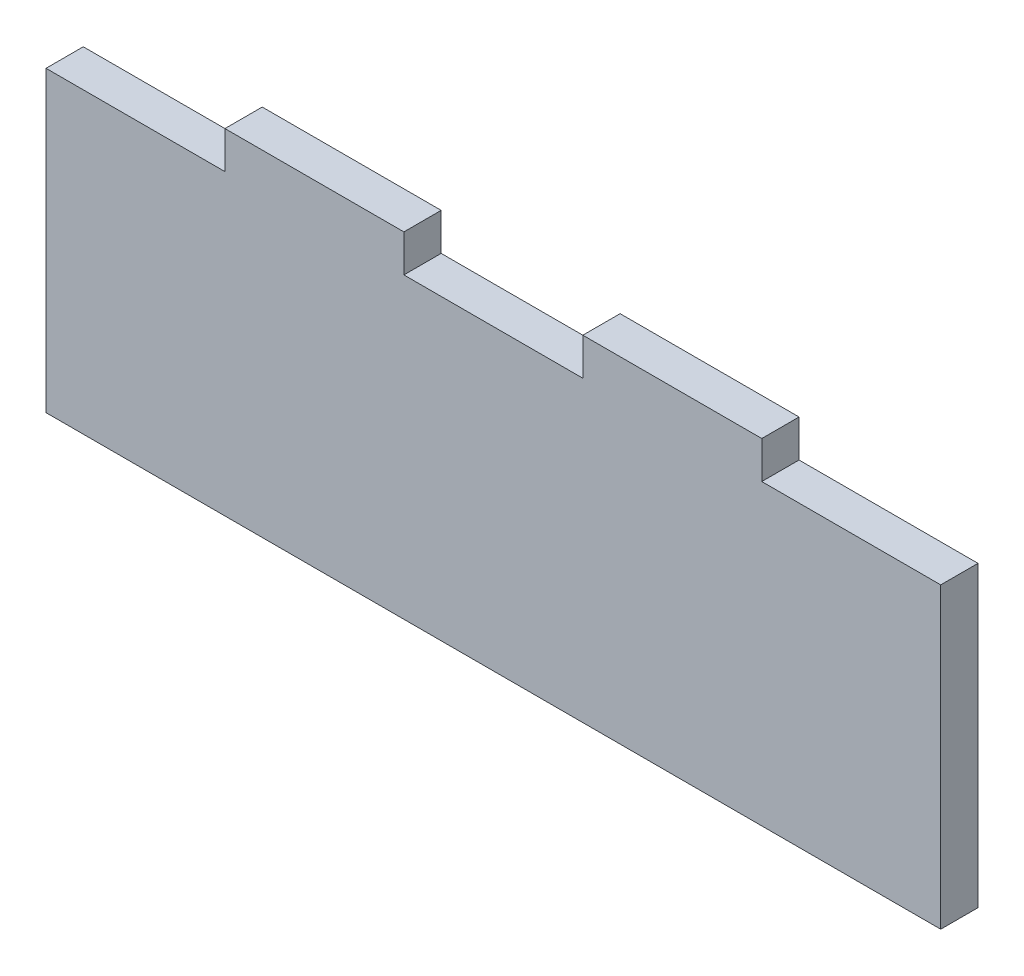
ISO-10303-21;
HEADER;
FILE_DESCRIPTION(('STEP AP214'),'2;1');
FILE_NAME('part.step','',(''),(''),'','','');
FILE_SCHEMA(('AUTOMOTIVE_DESIGN { 1 0 10303 214 1 1 1 1 }'));
ENDSEC;
DATA;
#1=APPLICATION_CONTEXT('core data for automotive mechanical design processes');
#2=APPLICATION_PROTOCOL_DEFINITION('international standard','automotive_design',2000,#1);
#3=PRODUCT_CONTEXT('',#1,'mechanical');
#4=PRODUCT('Part','Part','',(#3));
#5=PRODUCT_RELATED_PRODUCT_CATEGORY('part','',(#4));
#6=PRODUCT_DEFINITION_FORMATION('','',#4);
#7=PRODUCT_DEFINITION_CONTEXT('part definition',#1,'design');
#8=PRODUCT_DEFINITION('design','',#6,#7);
#9=PRODUCT_DEFINITION_SHAPE('','',#8);
#10=(LENGTH_UNIT() NAMED_UNIT(*) SI_UNIT(.MILLI.,.METRE.));
#11=(NAMED_UNIT(*) PLANE_ANGLE_UNIT() SI_UNIT($,.RADIAN.));
#12=(NAMED_UNIT(*) SI_UNIT($,.STERADIAN.) SOLID_ANGLE_UNIT());
#13=UNCERTAINTY_MEASURE_WITH_UNIT(LENGTH_MEASURE(1.E-05),#10,'distance_accuracy_value','');
#14=(GEOMETRIC_REPRESENTATION_CONTEXT(3) GLOBAL_UNCERTAINTY_ASSIGNED_CONTEXT((#13)) GLOBAL_UNIT_ASSIGNED_CONTEXT((#10,
#11,#12)) REPRESENTATION_CONTEXT('',''));
#15=CARTESIAN_POINT('',(0.,0.,0.));
#16=DIRECTION('',(0.,0.,1.));
#17=DIRECTION('',(1.,0.,0.));
#18=AXIS2_PLACEMENT_3D('',#15,#16,#17);
#19=CARTESIAN_POINT('',(30.48,50.8,6.35));
#20=DIRECTION('',(0.,-1.,0.));
#21=DIRECTION('',(0.,0.,-1.));
#22=AXIS2_PLACEMENT_3D('',#19,#20,#21);
#23=PLANE('',#22);
#24=DIRECTION('',(-1.,0.,0.));
#25=VECTOR('',#24,1.);
#26=CARTESIAN_POINT('',(30.48,50.8,0.));
#27=LINE('',#26,#25);
#28=CARTESIAN_POINT('',(30.48,50.8,0.));
#29=VERTEX_POINT('',#28);
#30=CARTESIAN_POINT('',(0.,50.8,0.));
#31=VERTEX_POINT('',#30);
#32=EDGE_CURVE('E164',#29,#31,#27,.T.);
#33=ORIENTED_EDGE('',*,*,#32,.T.);
#34=DIRECTION('',(0.,0.,-1.));
#35=VECTOR('',#34,1.);
#36=CARTESIAN_POINT('',(0.,50.8,6.35));
#37=LINE('',#36,#35);
#38=CARTESIAN_POINT('',(0.,50.8,6.35));
#39=VERTEX_POINT('',#38);
#40=EDGE_CURVE('E11',#39,#31,#37,.T.);
#41=ORIENTED_EDGE('',*,*,#40,.F.);
#42=DIRECTION('',(-1.,0.,0.));
#43=VECTOR('',#42,1.);
#44=CARTESIAN_POINT('',(30.48,50.8,6.35));
#45=LINE('',#44,#43);
#46=CARTESIAN_POINT('',(30.48,50.8,6.35));
#47=VERTEX_POINT('',#46);
#48=EDGE_CURVE('E198',#47,#39,#45,.T.);
#49=ORIENTED_EDGE('',*,*,#48,.F.);
#50=DIRECTION('',(0.,0.,-1.));
#51=VECTOR('',#50,1.);
#52=CARTESIAN_POINT('',(30.48,50.8,6.35));
#53=LINE('',#52,#51);
#54=EDGE_CURVE('E160',#47,#29,#53,.T.);
#55=ORIENTED_EDGE('',*,*,#54,.T.);
#56=EDGE_LOOP('',(#33,#41,#49,#55));
#57=FACE_BOUND('',#56,.T.);
#58=ADVANCED_FACE('F39',(#57),#23,.F.);
#59=CARTESIAN_POINT('',(0.,50.8,6.35));
#60=DIRECTION('',(1.,0.,0.));
#61=DIRECTION('',(0.,0.,-1.));
#62=AXIS2_PLACEMENT_3D('',#59,#60,#61);
#63=PLANE('',#62);
#64=DIRECTION('',(0.,-1.,0.));
#65=VECTOR('',#64,1.);
#66=CARTESIAN_POINT('',(0.,50.8,0.));
#67=LINE('',#66,#65);
#68=CARTESIAN_POINT('',(0.,0.,0.));
#69=VERTEX_POINT('',#68);
#70=EDGE_CURVE('E168',#31,#69,#67,.T.);
#71=ORIENTED_EDGE('',*,*,#70,.T.);
#72=DIRECTION('',(0.,0.,-1.));
#73=VECTOR('',#72,1.);
#74=CARTESIAN_POINT('',(0.,0.,6.35));
#75=LINE('',#74,#73);
#76=CARTESIAN_POINT('',(0.,0.,6.35));
#77=VERTEX_POINT('',#76);
#78=EDGE_CURVE('E48',#77,#69,#75,.T.);
#79=ORIENTED_EDGE('',*,*,#78,.F.);
#80=DIRECTION('',(0.,-1.,0.));
#81=VECTOR('',#80,1.);
#82=CARTESIAN_POINT('',(0.,50.8,6.35));
#83=LINE('',#82,#81);
#84=EDGE_CURVE('E111',#39,#77,#83,.T.);
#85=ORIENTED_EDGE('',*,*,#84,.F.);
#86=ORIENTED_EDGE('',*,*,#40,.T.);
#87=EDGE_LOOP('',(#71,#79,#85,#86));
#88=FACE_BOUND('',#87,.T.);
#89=ADVANCED_FACE('F292',(#88),#63,.F.);
#90=CARTESIAN_POINT('',(0.,0.,6.35));
#91=DIRECTION('',(0.,1.,0.));
#92=DIRECTION('',(0.,0.,1.));
#93=AXIS2_PLACEMENT_3D('',#90,#91,#92);
#94=PLANE('',#93);
#95=DIRECTION('',(1.,0.,0.));
#96=VECTOR('',#95,1.);
#97=CARTESIAN_POINT('',(0.,0.,0.));
#98=LINE('',#97,#96);
#99=CARTESIAN_POINT('',(152.4,0.,0.));
#100=VERTEX_POINT('',#99);
#101=EDGE_CURVE('E171',#69,#100,#98,.T.);
#102=ORIENTED_EDGE('',*,*,#101,.T.);
#103=DIRECTION('',(0.,0.,-1.));
#104=VECTOR('',#103,1.);
#105=CARTESIAN_POINT('',(152.4,0.,6.35));
#106=LINE('',#105,#104);
#107=CARTESIAN_POINT('',(152.4,0.,6.35));
#108=VERTEX_POINT('',#107);
#109=EDGE_CURVE('E225',#108,#100,#106,.T.);
#110=ORIENTED_EDGE('',*,*,#109,.F.);
#111=DIRECTION('',(1.,0.,0.));
#112=VECTOR('',#111,1.);
#113=CARTESIAN_POINT('',(0.,0.,6.35));
#114=LINE('',#113,#112);
#115=EDGE_CURVE('E235',#77,#108,#114,.T.);
#116=ORIENTED_EDGE('',*,*,#115,.F.);
#117=ORIENTED_EDGE('',*,*,#78,.T.);
#118=EDGE_LOOP('',(#102,#110,#116,#117));
#119=FACE_BOUND('',#118,.T.);
#120=ADVANCED_FACE('F233',(#119),#94,.F.);
#121=CARTESIAN_POINT('',(152.4,0.,6.35));
#122=DIRECTION('',(-1.,0.,0.));
#123=DIRECTION('',(0.,0.,1.));
#124=AXIS2_PLACEMENT_3D('',#121,#122,#123);
#125=PLANE('',#124);
#126=DIRECTION('',(0.,1.,0.));
#127=VECTOR('',#126,1.);
#128=CARTESIAN_POINT('',(152.4,0.,0.));
#129=LINE('',#128,#127);
#130=CARTESIAN_POINT('',(152.4,50.8,0.));
#131=VERTEX_POINT('',#130);
#132=EDGE_CURVE('E174',#100,#131,#129,.T.);
#133=ORIENTED_EDGE('',*,*,#132,.T.);
#134=DIRECTION('',(0.,0.,-1.));
#135=VECTOR('',#134,1.);
#136=CARTESIAN_POINT('',(152.4,50.8,6.35));
#137=LINE('',#136,#135);
#138=CARTESIAN_POINT('',(152.4,50.8,6.35));
#139=VERTEX_POINT('',#138);
#140=EDGE_CURVE('E221',#139,#131,#137,.T.);
#141=ORIENTED_EDGE('',*,*,#140,.F.);
#142=DIRECTION('',(0.,1.,0.));
#143=VECTOR('',#142,1.);
#144=CARTESIAN_POINT('',(152.4,0.,6.35));
#145=LINE('',#144,#143);
#146=EDGE_CURVE('E254',#108,#139,#145,.T.);
#147=ORIENTED_EDGE('',*,*,#146,.F.);
#148=ORIENTED_EDGE('',*,*,#109,.T.);
#149=EDGE_LOOP('',(#133,#141,#147,#148));
#150=FACE_BOUND('',#149,.T.);
#151=ADVANCED_FACE('F244',(#150),#125,.F.);
#152=CARTESIAN_POINT('',(152.4,50.8,6.35));
#153=DIRECTION('',(0.,-1.,0.));
#154=DIRECTION('',(0.,0.,-1.));
#155=AXIS2_PLACEMENT_3D('',#152,#153,#154);
#156=PLANE('',#155);
#157=DIRECTION('',(-1.,0.,0.));
#158=VECTOR('',#157,1.);
#159=CARTESIAN_POINT('',(152.4,50.8,0.));
#160=LINE('',#159,#158);
#161=CARTESIAN_POINT('',(121.92,50.8,0.));
#162=VERTEX_POINT('',#161);
#163=EDGE_CURVE('E177',#131,#162,#160,.T.);
#164=ORIENTED_EDGE('',*,*,#163,.T.);
#165=DIRECTION('',(0.,0.,-1.));
#166=VECTOR('',#165,1.);
#167=CARTESIAN_POINT('',(121.92,50.8,6.35));
#168=LINE('',#167,#166);
#169=CARTESIAN_POINT('',(121.92,50.8,6.35));
#170=VERTEX_POINT('',#169);
#171=EDGE_CURVE('E217',#170,#162,#168,.T.);
#172=ORIENTED_EDGE('',*,*,#171,.F.);
#173=DIRECTION('',(-1.,0.,0.));
#174=VECTOR('',#173,1.);
#175=CARTESIAN_POINT('',(152.4,50.8,6.35));
#176=LINE('',#175,#174);
#177=EDGE_CURVE('E250',#139,#170,#176,.T.);
#178=ORIENTED_EDGE('',*,*,#177,.F.);
#179=ORIENTED_EDGE('',*,*,#140,.T.);
#180=EDGE_LOOP('',(#164,#172,#178,#179));
#181=FACE_BOUND('',#180,.T.);
#182=ADVANCED_FACE('F248',(#181),#156,.F.);
#183=CARTESIAN_POINT('',(121.92,50.8,6.35));
#184=DIRECTION('',(-1.,0.,0.));
#185=DIRECTION('',(0.,0.,1.));
#186=AXIS2_PLACEMENT_3D('',#183,#184,#185);
#187=PLANE('',#186);
#188=DIRECTION('',(0.,1.,0.));
#189=VECTOR('',#188,1.);
#190=CARTESIAN_POINT('',(121.92,50.8,0.));
#191=LINE('',#190,#189);
#192=CARTESIAN_POINT('',(121.92,57.15,0.));
#193=VERTEX_POINT('',#192);
#194=EDGE_CURVE('E180',#162,#193,#191,.T.);
#195=ORIENTED_EDGE('',*,*,#194,.T.);
#196=DIRECTION('',(0.,0.,-1.));
#197=VECTOR('',#196,1.);
#198=CARTESIAN_POINT('',(121.92,57.15,6.35));
#199=LINE('',#198,#197);
#200=CARTESIAN_POINT('',(121.92,57.15,6.35));
#201=VERTEX_POINT('',#200);
#202=EDGE_CURVE('E213',#201,#193,#199,.T.);
#203=ORIENTED_EDGE('',*,*,#202,.F.);
#204=DIRECTION('',(0.,1.,0.));
#205=VECTOR('',#204,1.);
#206=CARTESIAN_POINT('',(121.92,50.8,6.35));
#207=LINE('',#206,#205);
#208=EDGE_CURVE('E253',#170,#201,#207,.T.);
#209=ORIENTED_EDGE('',*,*,#208,.F.);
#210=ORIENTED_EDGE('',*,*,#171,.T.);
#211=EDGE_LOOP('',(#195,#203,#209,#210));
#212=FACE_BOUND('',#211,.T.);
#213=ADVANCED_FACE('F305',(#212),#187,.F.);
#214=CARTESIAN_POINT('',(121.92,57.15,6.35));
#215=DIRECTION('',(0.,-1.,0.));
#216=DIRECTION('',(0.,0.,-1.));
#217=AXIS2_PLACEMENT_3D('',#214,#215,#216);
#218=PLANE('',#217);
#219=DIRECTION('',(-1.,0.,0.));
#220=VECTOR('',#219,1.);
#221=CARTESIAN_POINT('',(121.92,57.15,0.));
#222=LINE('',#221,#220);
#223=CARTESIAN_POINT('',(91.44,57.15,0.));
#224=VERTEX_POINT('',#223);
#225=EDGE_CURVE('E183',#193,#224,#222,.T.);
#226=ORIENTED_EDGE('',*,*,#225,.T.);
#227=DIRECTION('',(0.,0.,-1.));
#228=VECTOR('',#227,1.);
#229=CARTESIAN_POINT('',(91.44,57.15,6.35));
#230=LINE('',#229,#228);
#231=CARTESIAN_POINT('',(91.44,57.15,6.35));
#232=VERTEX_POINT('',#231);
#233=EDGE_CURVE('E209',#232,#224,#230,.T.);
#234=ORIENTED_EDGE('',*,*,#233,.F.);
#235=DIRECTION('',(-1.,0.,0.));
#236=VECTOR('',#235,1.);
#237=CARTESIAN_POINT('',(121.92,57.15,6.35));
#238=LINE('',#237,#236);
#239=EDGE_CURVE('E258',#201,#232,#238,.T.);
#240=ORIENTED_EDGE('',*,*,#239,.F.);
#241=ORIENTED_EDGE('',*,*,#202,.T.);
#242=EDGE_LOOP('',(#226,#234,#240,#241));
#243=FACE_BOUND('',#242,.T.);
#244=ADVANCED_FACE('F308',(#243),#218,.F.);
#245=CARTESIAN_POINT('',(91.44,57.15,6.35));
#246=DIRECTION('',(1.,0.,0.));
#247=DIRECTION('',(0.,0.,-1.));
#248=AXIS2_PLACEMENT_3D('',#245,#246,#247);
#249=PLANE('',#248);
#250=DIRECTION('',(0.,-1.,0.));
#251=VECTOR('',#250,1.);
#252=CARTESIAN_POINT('',(91.44,57.15,0.));
#253=LINE('',#252,#251);
#254=CARTESIAN_POINT('',(91.44,50.8,0.));
#255=VERTEX_POINT('',#254);
#256=EDGE_CURVE('E186',#224,#255,#253,.T.);
#257=ORIENTED_EDGE('',*,*,#256,.T.);
#258=DIRECTION('',(0.,0.,-1.));
#259=VECTOR('',#258,1.);
#260=CARTESIAN_POINT('',(91.44,50.8,6.35));
#261=LINE('',#260,#259);
#262=CARTESIAN_POINT('',(91.44,50.8,6.35));
#263=VERTEX_POINT('',#262);
#264=EDGE_CURVE('E205',#263,#255,#261,.T.);
#265=ORIENTED_EDGE('',*,*,#264,.F.);
#266=DIRECTION('',(0.,-1.,0.));
#267=VECTOR('',#266,1.);
#268=CARTESIAN_POINT('',(91.44,57.15,6.35));
#269=LINE('',#268,#267);
#270=EDGE_CURVE('E265',#232,#263,#269,.T.);
#271=ORIENTED_EDGE('',*,*,#270,.F.);
#272=ORIENTED_EDGE('',*,*,#233,.T.);
#273=EDGE_LOOP('',(#257,#265,#271,#272));
#274=FACE_BOUND('',#273,.T.);
#275=ADVANCED_FACE('F273',(#274),#249,.F.);
#276=CARTESIAN_POINT('',(91.44,50.8,6.35));
#277=DIRECTION('',(0.,-1.,0.));
#278=DIRECTION('',(0.,0.,-1.));
#279=AXIS2_PLACEMENT_3D('',#276,#277,#278);
#280=PLANE('',#279);
#281=DIRECTION('',(-1.,0.,0.));
#282=VECTOR('',#281,1.);
#283=CARTESIAN_POINT('',(91.44,50.8,0.));
#284=LINE('',#283,#282);
#285=CARTESIAN_POINT('',(60.96,50.8,0.));
#286=VERTEX_POINT('',#285);
#287=EDGE_CURVE('E189',#255,#286,#284,.T.);
#288=ORIENTED_EDGE('',*,*,#287,.T.);
#289=DIRECTION('',(0.,0.,-1.));
#290=VECTOR('',#289,1.);
#291=CARTESIAN_POINT('',(60.96,50.8,6.35));
#292=LINE('',#291,#290);
#293=CARTESIAN_POINT('',(60.96,50.8,6.35));
#294=VERTEX_POINT('',#293);
#295=EDGE_CURVE('E153',#294,#286,#292,.T.);
#296=ORIENTED_EDGE('',*,*,#295,.F.);
#297=DIRECTION('',(-1.,0.,0.));
#298=VECTOR('',#297,1.);
#299=CARTESIAN_POINT('',(91.44,50.8,6.35));
#300=LINE('',#299,#298);
#301=EDGE_CURVE('E142',#263,#294,#300,.T.);
#302=ORIENTED_EDGE('',*,*,#301,.F.);
#303=ORIENTED_EDGE('',*,*,#264,.T.);
#304=EDGE_LOOP('',(#288,#296,#302,#303));
#305=FACE_BOUND('',#304,.T.);
#306=ADVANCED_FACE('F277',(#305),#280,.F.);
#307=CARTESIAN_POINT('',(60.96,50.8,6.35));
#308=DIRECTION('',(-1.,0.,0.));
#309=DIRECTION('',(0.,0.,1.));
#310=AXIS2_PLACEMENT_3D('',#307,#308,#309);
#311=PLANE('',#310);
#312=DIRECTION('',(0.,1.,0.));
#313=VECTOR('',#312,1.);
#314=CARTESIAN_POINT('',(60.96,50.8,0.));
#315=LINE('',#314,#313);
#316=CARTESIAN_POINT('',(60.96,57.15,0.));
#317=VERTEX_POINT('',#316);
#318=EDGE_CURVE('E151',#286,#317,#315,.T.);
#319=ORIENTED_EDGE('',*,*,#318,.T.);
#320=DIRECTION('',(0.,0.,-1.));
#321=VECTOR('',#320,1.);
#322=CARTESIAN_POINT('',(60.96,57.15,6.35));
#323=LINE('',#322,#321);
#324=CARTESIAN_POINT('',(60.96,57.15,6.35));
#325=VERTEX_POINT('',#324);
#326=EDGE_CURVE('E148',#325,#317,#323,.T.);
#327=ORIENTED_EDGE('',*,*,#326,.F.);
#328=DIRECTION('',(0.,1.,0.));
#329=VECTOR('',#328,1.);
#330=CARTESIAN_POINT('',(60.96,50.8,6.35));
#331=LINE('',#330,#329);
#332=EDGE_CURVE('E136',#294,#325,#331,.T.);
#333=ORIENTED_EDGE('',*,*,#332,.F.);
#334=ORIENTED_EDGE('',*,*,#295,.T.);
#335=EDGE_LOOP('',(#319,#327,#333,#334));
#336=FACE_BOUND('',#335,.T.);
#337=ADVANCED_FACE('F149',(#336),#311,.F.);
#338=CARTESIAN_POINT('',(60.96,57.15,6.35));
#339=DIRECTION('',(0.,-1.,0.));
#340=DIRECTION('',(0.,0.,-1.));
#341=AXIS2_PLACEMENT_3D('',#338,#339,#340);
#342=PLANE('',#341);
#343=DIRECTION('',(-1.,0.,0.));
#344=VECTOR('',#343,1.);
#345=CARTESIAN_POINT('',(60.96,57.15,0.));
#346=LINE('',#345,#344);
#347=CARTESIAN_POINT('',(30.48,57.15,0.));
#348=VERTEX_POINT('',#347);
#349=EDGE_CURVE('E97',#317,#348,#346,.T.);
#350=ORIENTED_EDGE('',*,*,#349,.T.);
#351=DIRECTION('',(0.,0.,-1.));
#352=VECTOR('',#351,1.);
#353=CARTESIAN_POINT('',(30.48,57.15,6.35));
#354=LINE('',#353,#352);
#355=CARTESIAN_POINT('',(30.48,57.15,6.35));
#356=VERTEX_POINT('',#355);
#357=EDGE_CURVE('E154',#356,#348,#354,.T.);
#358=ORIENTED_EDGE('',*,*,#357,.F.);
#359=DIRECTION('',(-1.,0.,0.));
#360=VECTOR('',#359,1.);
#361=CARTESIAN_POINT('',(60.96,57.15,6.35));
#362=LINE('',#361,#360);
#363=EDGE_CURVE('E140',#325,#356,#362,.T.);
#364=ORIENTED_EDGE('',*,*,#363,.F.);
#365=ORIENTED_EDGE('',*,*,#326,.T.);
#366=EDGE_LOOP('',(#350,#358,#364,#365));
#367=FACE_BOUND('',#366,.T.);
#368=ADVANCED_FACE('F156',(#367),#342,.F.);
#369=CARTESIAN_POINT('',(30.48,57.15,6.35));
#370=DIRECTION('',(1.,0.,0.));
#371=DIRECTION('',(0.,1.,0.));
#372=AXIS2_PLACEMENT_3D('',#369,#370,#371);
#373=PLANE('',#372);
#374=DIRECTION('',(0.,-1.,0.));
#375=VECTOR('',#374,1.);
#376=CARTESIAN_POINT('',(30.48,57.15,0.));
#377=LINE('',#376,#375);
#378=EDGE_CURVE('E103',#348,#29,#377,.T.);
#379=ORIENTED_EDGE('',*,*,#378,.T.);
#380=ORIENTED_EDGE('',*,*,#54,.F.);
#381=DIRECTION('',(0.,-1.,0.));
#382=VECTOR('',#381,1.);
#383=CARTESIAN_POINT('',(30.48,57.15,6.35));
#384=LINE('',#383,#382);
#385=EDGE_CURVE('E56',#356,#47,#384,.T.);
#386=ORIENTED_EDGE('',*,*,#385,.F.);
#387=ORIENTED_EDGE('',*,*,#357,.T.);
#388=EDGE_LOOP('',(#379,#380,#386,#387));
#389=FACE_BOUND('',#388,.T.);
#390=ADVANCED_FACE('F281',(#389),#373,.F.);
#391=CARTESIAN_POINT('',(0.,0.,6.35));
#392=DIRECTION('',(0.,0.,1.));
#393=DIRECTION('',(1.,0.,0.));
#394=AXIS2_PLACEMENT_3D('',#391,#392,#393);
#395=PLANE('',#394);
#396=ORIENTED_EDGE('',*,*,#48,.T.);
#397=ORIENTED_EDGE('',*,*,#84,.T.);
#398=ORIENTED_EDGE('',*,*,#115,.T.);
#399=ORIENTED_EDGE('',*,*,#146,.T.);
#400=ORIENTED_EDGE('',*,*,#177,.T.);
#401=ORIENTED_EDGE('',*,*,#208,.T.);
#402=ORIENTED_EDGE('',*,*,#239,.T.);
#403=ORIENTED_EDGE('',*,*,#270,.T.);
#404=ORIENTED_EDGE('',*,*,#301,.T.);
#405=ORIENTED_EDGE('',*,*,#332,.T.);
#406=ORIENTED_EDGE('',*,*,#363,.T.);
#407=ORIENTED_EDGE('',*,*,#385,.T.);
#408=EDGE_LOOP('',(#396,#397,#398,#399,#400,#401,#402,#403,#404,#405,#406,#407));
#409=FACE_BOUND('',#408,.T.);
#410=ADVANCED_FACE('F138',(#409),#395,.T.);
#411=CARTESIAN_POINT('',(0.,0.,0.));
#412=DIRECTION('',(0.,0.,1.));
#413=DIRECTION('',(1.,0.,0.));
#414=AXIS2_PLACEMENT_3D('',#411,#412,#413);
#415=PLANE('',#414);
#416=ORIENTED_EDGE('',*,*,#32,.F.);
#417=ORIENTED_EDGE('',*,*,#378,.F.);
#418=ORIENTED_EDGE('',*,*,#349,.F.);
#419=ORIENTED_EDGE('',*,*,#318,.F.);
#420=ORIENTED_EDGE('',*,*,#287,.F.);
#421=ORIENTED_EDGE('',*,*,#256,.F.);
#422=ORIENTED_EDGE('',*,*,#225,.F.);
#423=ORIENTED_EDGE('',*,*,#194,.F.);
#424=ORIENTED_EDGE('',*,*,#163,.F.);
#425=ORIENTED_EDGE('',*,*,#132,.F.);
#426=ORIENTED_EDGE('',*,*,#101,.F.);
#427=ORIENTED_EDGE('',*,*,#70,.F.);
#428=EDGE_LOOP('',(#416,#417,#418,#419,#420,#421,#422,#423,#424,#425,#426,#427));
#429=FACE_BOUND('',#428,.T.);
#430=ADVANCED_FACE('F239',(#429),#415,.F.);
#431=CLOSED_SHELL('',(#58,#89,#120,#151,#182,#213,#244,#275,#306,#337,#368,#390,#410,#430));
#432=MANIFOLD_SOLID_BREP('B2',#431);
#433=ADVANCED_BREP_SHAPE_REPRESENTATION('',(#18,#432),#14);
#434=SHAPE_DEFINITION_REPRESENTATION(#9,#433);
ENDSEC;
END-ISO-10303-21;
